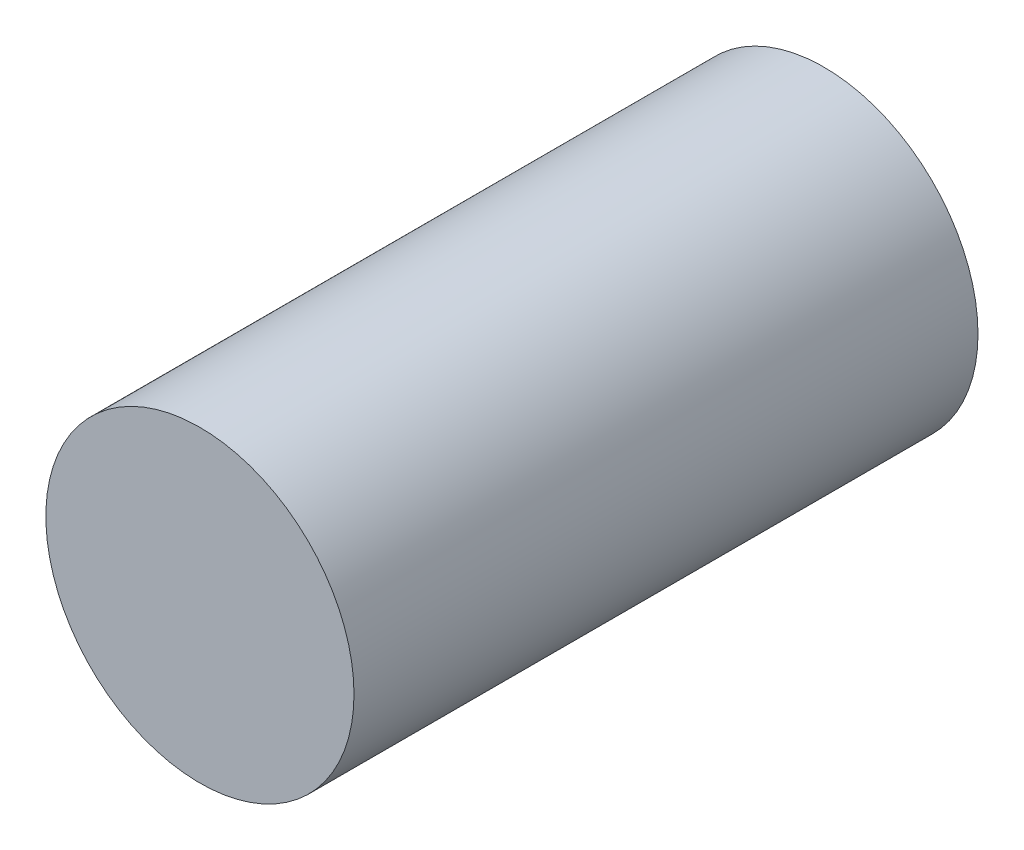
ISO-10303-21;
HEADER;
FILE_DESCRIPTION(('STEP AP214'),'2;1');
FILE_NAME('part.step','',(''),(''),'','','');
FILE_SCHEMA(('AUTOMOTIVE_DESIGN { 1 0 10303 214 1 1 1 1 }'));
ENDSEC;
DATA;
#1=APPLICATION_CONTEXT('core data for automotive mechanical design processes');
#2=APPLICATION_PROTOCOL_DEFINITION('international standard','automotive_design',2000,#1);
#3=PRODUCT_CONTEXT('',#1,'mechanical');
#4=PRODUCT('Part','Part','',(#3));
#5=PRODUCT_RELATED_PRODUCT_CATEGORY('part','',(#4));
#6=PRODUCT_DEFINITION_FORMATION('','',#4);
#7=PRODUCT_DEFINITION_CONTEXT('part definition',#1,'design');
#8=PRODUCT_DEFINITION('design','',#6,#7);
#9=PRODUCT_DEFINITION_SHAPE('','',#8);
#10=(LENGTH_UNIT() NAMED_UNIT(*) SI_UNIT(.MILLI.,.METRE.));
#11=(NAMED_UNIT(*) PLANE_ANGLE_UNIT() SI_UNIT($,.RADIAN.));
#12=(NAMED_UNIT(*) SI_UNIT($,.STERADIAN.) SOLID_ANGLE_UNIT());
#13=UNCERTAINTY_MEASURE_WITH_UNIT(LENGTH_MEASURE(1.E-05),#10,'distance_accuracy_value','');
#14=(GEOMETRIC_REPRESENTATION_CONTEXT(3) GLOBAL_UNCERTAINTY_ASSIGNED_CONTEXT((#13)) GLOBAL_UNIT_ASSIGNED_CONTEXT((#10,
#11,#12)) REPRESENTATION_CONTEXT('',''));
#15=CARTESIAN_POINT('',(0.,0.,0.));
#16=DIRECTION('',(0.,0.,1.));
#17=DIRECTION('',(1.,0.,0.));
#18=AXIS2_PLACEMENT_3D('',#15,#16,#17);
#19=CARTESIAN_POINT('',(0.,0.,162.));
#20=DIRECTION('',(0.,0.,-1.));
#21=DIRECTION('',(-1.,0.,0.));
#22=AXIS2_PLACEMENT_3D('',#19,#20,#21);
#23=CYLINDRICAL_SURFACE('',#22,40.);
#24=CARTESIAN_POINT('',(0.,0.,162.));
#25=DIRECTION('',(0.,0.,1.));
#26=DIRECTION('',(1.,0.,0.));
#27=AXIS2_PLACEMENT_3D('',#24,#25,#26);
#28=CIRCLE('',#27,40.);
#29=CARTESIAN_POINT('',(40.,0.,162.));
#30=VERTEX_POINT('',#29);
#31=EDGE_CURVE('E10',#30,#30,#28,.T.);
#32=ORIENTED_EDGE('',*,*,#31,.F.);
#33=EDGE_LOOP('',(#32));
#34=FACE_BOUND('',#33,.T.);
#35=CARTESIAN_POINT('',(0.,0.,0.));
#36=DIRECTION('',(0.,0.,1.));
#37=DIRECTION('',(1.,0.,0.));
#38=AXIS2_PLACEMENT_3D('',#35,#36,#37);
#39=CIRCLE('',#38,40.);
#40=CARTESIAN_POINT('',(40.,0.,0.));
#41=VERTEX_POINT('',#40);
#42=EDGE_CURVE('E33',#41,#41,#39,.T.);
#43=ORIENTED_EDGE('',*,*,#42,.T.);
#44=EDGE_LOOP('',(#43));
#45=FACE_BOUND('',#44,.T.);
#46=ADVANCED_FACE('F30',(#34,#45),#23,.T.);
#47=CARTESIAN_POINT('',(0.,0.,162.));
#48=DIRECTION('',(0.,0.,1.));
#49=DIRECTION('',(1.,0.,0.));
#50=AXIS2_PLACEMENT_3D('',#47,#48,#49);
#51=PLANE('',#50);
#52=ORIENTED_EDGE('',*,*,#31,.T.);
#53=EDGE_LOOP('',(#52));
#54=FACE_BOUND('',#53,.T.);
#55=ADVANCED_FACE('F45',(#54),#51,.T.);
#56=CARTESIAN_POINT('',(0.,0.,0.));
#57=DIRECTION('',(0.,0.,1.));
#58=DIRECTION('',(1.,0.,0.));
#59=AXIS2_PLACEMENT_3D('',#56,#57,#58);
#60=PLANE('',#59);
#61=ORIENTED_EDGE('',*,*,#42,.F.);
#62=EDGE_LOOP('',(#61));
#63=FACE_BOUND('',#62,.T.);
#64=ADVANCED_FACE('F43',(#63),#60,.F.);
#65=CLOSED_SHELL('',(#46,#55,#64));
#66=MANIFOLD_SOLID_BREP('B2',#65);
#67=ADVANCED_BREP_SHAPE_REPRESENTATION('',(#18,#66),#14);
#68=SHAPE_DEFINITION_REPRESENTATION(#9,#67);
ENDSEC;
END-ISO-10303-21;
